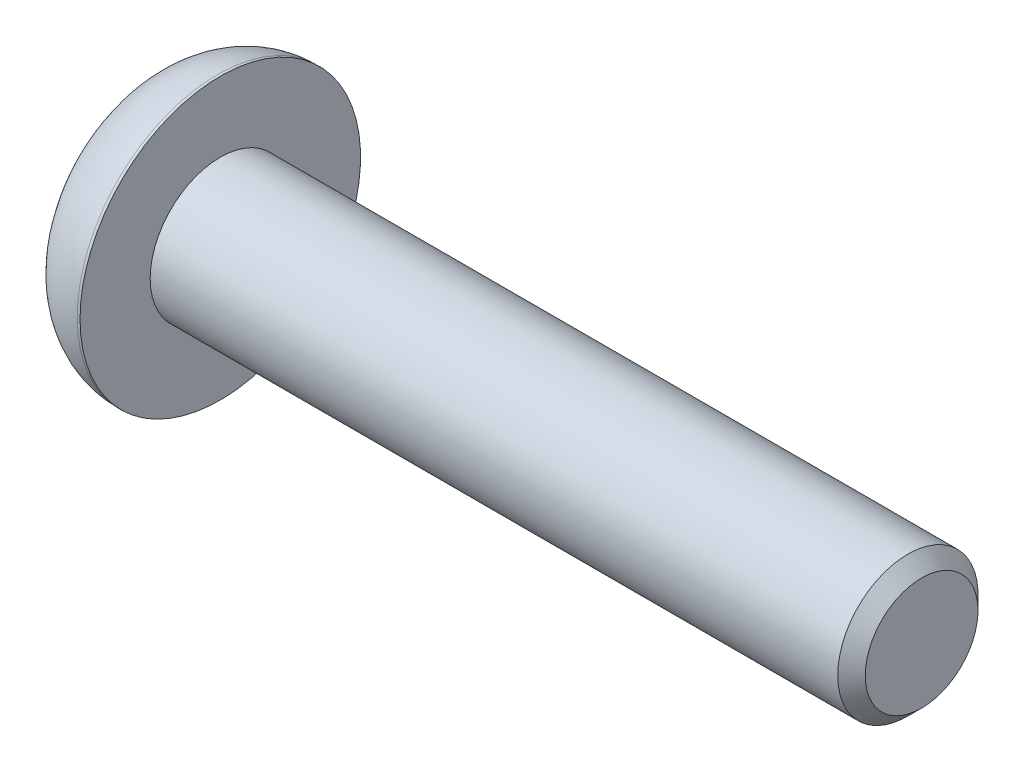
ISO-10303-21;
HEADER;
FILE_DESCRIPTION(('STEP AP214'),'2;1');
FILE_NAME('part.step','',(''),(''),'','','');
FILE_SCHEMA(('AUTOMOTIVE_DESIGN { 1 0 10303 214 1 1 1 1 }'));
ENDSEC;
DATA;
#1=APPLICATION_CONTEXT('core data for automotive mechanical design processes');
#2=APPLICATION_PROTOCOL_DEFINITION('international standard','automotive_design',2000,#1);
#3=PRODUCT_CONTEXT('',#1,'mechanical');
#4=PRODUCT('Part','Part','',(#3));
#5=PRODUCT_RELATED_PRODUCT_CATEGORY('part','',(#4));
#6=PRODUCT_DEFINITION_FORMATION('','',#4);
#7=PRODUCT_DEFINITION_CONTEXT('part definition',#1,'design');
#8=PRODUCT_DEFINITION('design','',#6,#7);
#9=PRODUCT_DEFINITION_SHAPE('','',#8);
#10=(LENGTH_UNIT() NAMED_UNIT(*) SI_UNIT(.MILLI.,.METRE.));
#11=(NAMED_UNIT(*) PLANE_ANGLE_UNIT() SI_UNIT($,.RADIAN.));
#12=(NAMED_UNIT(*) SI_UNIT($,.STERADIAN.) SOLID_ANGLE_UNIT());
#13=UNCERTAINTY_MEASURE_WITH_UNIT(LENGTH_MEASURE(1.E-05),#10,'distance_accuracy_value','');
#14=(GEOMETRIC_REPRESENTATION_CONTEXT(3) GLOBAL_UNCERTAINTY_ASSIGNED_CONTEXT((#13)) GLOBAL_UNIT_ASSIGNED_CONTEXT((#10,
#11,#12)) REPRESENTATION_CONTEXT('',''));
#15=CARTESIAN_POINT('',(0.,0.,0.));
#16=DIRECTION('',(0.,0.,1.));
#17=DIRECTION('',(1.,0.,0.));
#18=AXIS2_PLACEMENT_3D('',#15,#16,#17);
#19=CARTESIAN_POINT('',(1.82,0.,0.));
#20=DIRECTION('',(-1.,0.,0.));
#21=DIRECTION('',(0.,0.,1.));
#22=AXIS2_PLACEMENT_3D('',#19,#20,#21);
#23=PLANE('',#22);
#24=CARTESIAN_POINT('',(1.82,0.,0.));
#25=DIRECTION('',(-1.,0.,0.));
#26=DIRECTION('',(0.,0.,1.));
#27=AXIS2_PLACEMENT_3D('',#24,#25,#26);
#28=CIRCLE('',#27,1.49999999999999);
#29=CARTESIAN_POINT('',(1.82,0.,1.49999999999999));
#30=VERTEX_POINT('',#29);
#31=CARTESIAN_POINT('',(1.82,1.29903810567665,0.749999999999995));
#32=VERTEX_POINT('',#31);
#33=EDGE_CURVE('E120',#30,#32,#28,.T.);
#34=ORIENTED_EDGE('',*,*,#33,.F.);
#35=DIRECTION('',(0.,1.,0.));
#36=VECTOR('',#35,1.);
#37=CARTESIAN_POINT('',(1.82,-0.866025403784438,1.5));
#38=LINE('',#37,#36);
#39=CARTESIAN_POINT('',(1.82,0.866025403784439,1.5));
#40=VERTEX_POINT('',#39);
#41=EDGE_CURVE('E148',#30,#40,#38,.T.);
#42=ORIENTED_EDGE('',*,*,#41,.T.);
#43=DIRECTION('',(0.,0.5,-0.866025403784439));
#44=VECTOR('',#43,1.);
#45=CARTESIAN_POINT('',(1.82,0.866025403784439,1.5));
#46=LINE('',#45,#44);
#47=EDGE_CURVE('E128',#40,#32,#46,.T.);
#48=ORIENTED_EDGE('',*,*,#47,.T.);
#49=EDGE_LOOP('',(#34,#42,#48));
#50=FACE_BOUND('',#49,.T.);
#51=ADVANCED_FACE('F37',(#50),#23,.T.);
#52=CARTESIAN_POINT('',(1.82,1.29903810567665,-0.749999999999994));
#53=VERTEX_POINT('',#52);
#54=EDGE_CURVE('E125',#32,#53,#28,.T.);
#55=ORIENTED_EDGE('',*,*,#54,.F.);
#56=CARTESIAN_POINT('',(1.82,1.73205080756888,0.));
#57=VERTEX_POINT('',#56);
#58=EDGE_CURVE('E132',#32,#57,#46,.T.);
#59=ORIENTED_EDGE('',*,*,#58,.T.);
#60=DIRECTION('',(0.,-0.5,-0.866025403784439));
#61=VECTOR('',#60,1.);
#62=CARTESIAN_POINT('',(1.82,1.73205080756888,0.));
#63=LINE('',#62,#61);
#64=EDGE_CURVE('E133',#57,#53,#63,.T.);
#65=ORIENTED_EDGE('',*,*,#64,.T.);
#66=EDGE_LOOP('',(#55,#59,#65));
#67=FACE_BOUND('',#66,.T.);
#68=ADVANCED_FACE('F204',(#67),#23,.T.);
#69=CARTESIAN_POINT('',(1.82,0.,-1.49999999999999));
#70=VERTEX_POINT('',#69);
#71=EDGE_CURVE('E267',#53,#70,#28,.T.);
#72=ORIENTED_EDGE('',*,*,#71,.F.);
#73=CARTESIAN_POINT('',(1.82,0.866025403784439,-1.5));
#74=VERTEX_POINT('',#73);
#75=EDGE_CURVE('E131',#53,#74,#63,.T.);
#76=ORIENTED_EDGE('',*,*,#75,.T.);
#77=DIRECTION('',(0.,-1.,0.));
#78=VECTOR('',#77,1.);
#79=CARTESIAN_POINT('',(1.82,0.866025403784439,-1.5));
#80=LINE('',#79,#78);
#81=EDGE_CURVE('E137',#74,#70,#80,.T.);
#82=ORIENTED_EDGE('',*,*,#81,.T.);
#83=EDGE_LOOP('',(#72,#76,#82));
#84=FACE_BOUND('',#83,.T.);
#85=ADVANCED_FACE('F210',(#84),#23,.T.);
#86=CARTESIAN_POINT('',(1.82,-1.29903810567665,-0.749999999999995));
#87=VERTEX_POINT('',#86);
#88=EDGE_CURVE('E239',#70,#87,#28,.T.);
#89=ORIENTED_EDGE('',*,*,#88,.F.);
#90=CARTESIAN_POINT('',(1.82,-0.866025403784439,-1.5));
#91=VERTEX_POINT('',#90);
#92=EDGE_CURVE('E136',#70,#91,#80,.T.);
#93=ORIENTED_EDGE('',*,*,#92,.T.);
#94=DIRECTION('',(0.,-0.5,0.866025403784439));
#95=VECTOR('',#94,1.);
#96=CARTESIAN_POINT('',(1.82,-0.866025403784439,-1.5));
#97=LINE('',#96,#95);
#98=EDGE_CURVE('E141',#91,#87,#97,.T.);
#99=ORIENTED_EDGE('',*,*,#98,.T.);
#100=EDGE_LOOP('',(#89,#93,#99));
#101=FACE_BOUND('',#100,.T.);
#102=ADVANCED_FACE('F226',(#101),#23,.T.);
#103=CARTESIAN_POINT('',(1.82,-1.29903810567666,0.75));
#104=VERTEX_POINT('',#103);
#105=EDGE_CURVE('E52',#87,#104,#28,.T.);
#106=ORIENTED_EDGE('',*,*,#105,.F.);
#107=CARTESIAN_POINT('',(1.82,-1.73205080756888,0.));
#108=VERTEX_POINT('',#107);
#109=EDGE_CURVE('E140',#87,#108,#97,.T.);
#110=ORIENTED_EDGE('',*,*,#109,.T.);
#111=DIRECTION('',(0.,0.5,0.866025403784439));
#112=VECTOR('',#111,1.);
#113=CARTESIAN_POINT('',(1.82,-1.73205080756888,0.));
#114=LINE('',#113,#112);
#115=EDGE_CURVE('E145',#108,#104,#114,.T.);
#116=ORIENTED_EDGE('',*,*,#115,.T.);
#117=EDGE_LOOP('',(#106,#110,#116));
#118=FACE_BOUND('',#117,.T.);
#119=ADVANCED_FACE('F217',(#118),#23,.T.);
#120=CARTESIAN_POINT('',(2.8,5.,0.));
#121=DIRECTION('',(1.,0.,0.));
#122=DIRECTION('',(0.,0.,-1.));
#123=AXIS2_PLACEMENT_3D('',#120,#121,#122);
#124=PLANE('',#123);
#125=CARTESIAN_POINT('',(2.8,0.,0.));
#126=DIRECTION('',(-1.,0.,0.));
#127=DIRECTION('',(0.,0.,1.));
#128=AXIS2_PLACEMENT_3D('',#125,#126,#127);
#129=CIRCLE('',#128,5.);
#130=CARTESIAN_POINT('',(2.8,0.,5.));
#131=VERTEX_POINT('',#130);
#132=EDGE_CURVE('E181',#131,#131,#129,.T.);
#133=ORIENTED_EDGE('',*,*,#132,.F.);
#134=EDGE_LOOP('',(#133));
#135=FACE_BOUND('',#134,.T.);
#136=CARTESIAN_POINT('',(2.8,0.,0.));
#137=DIRECTION('',(1.,0.,0.));
#138=DIRECTION('',(0.,0.,-1.));
#139=AXIS2_PLACEMENT_3D('',#136,#137,#138);
#140=CIRCLE('',#139,2.5);
#141=CARTESIAN_POINT('',(2.8,0.,-2.5));
#142=VERTEX_POINT('',#141);
#143=EDGE_CURVE('E169',#142,#142,#140,.T.);
#144=ORIENTED_EDGE('',*,*,#143,.F.);
#145=EDGE_LOOP('',(#144));
#146=FACE_BOUND('',#145,.T.);
#147=ADVANCED_FACE('F225',(#135,#146),#124,.T.);
#148=CARTESIAN_POINT('',(2.8,0.,0.));
#149=DIRECTION('',(-1.,0.,0.));
#150=DIRECTION('',(0.,0.,1.));
#151=AXIS2_PLACEMENT_3D('',#148,#149,#150);
#152=CYLINDRICAL_SURFACE('',#151,5.);
#153=CARTESIAN_POINT('',(2.7,0.,0.));
#154=DIRECTION('',(-1.,0.,0.));
#155=DIRECTION('',(0.,0.,1.));
#156=AXIS2_PLACEMENT_3D('',#153,#154,#155);
#157=CIRCLE('',#156,5.);
#158=CARTESIAN_POINT('',(2.7,0.,5.));
#159=VERTEX_POINT('',#158);
#160=EDGE_CURVE('E11',#159,#159,#157,.F.);
#161=ORIENTED_EDGE('',*,*,#160,.T.);
#162=EDGE_LOOP('',(#161));
#163=FACE_BOUND('',#162,.T.);
#164=ORIENTED_EDGE('',*,*,#132,.T.);
#165=EDGE_LOOP('',(#164));
#166=FACE_BOUND('',#165,.T.);
#167=ADVANCED_FACE('F232',(#163,#166),#152,.T.);
#168=CARTESIAN_POINT('',(0.,0.,0.));
#169=DIRECTION('',(-1.,0.,0.));
#170=DIRECTION('',(0.,0.,1.));
#171=AXIS2_PLACEMENT_3D('',#168,#169,#170);
#172=PLANE('',#171);
#173=CARTESIAN_POINT('',(0.,0.,0.));
#174=DIRECTION('',(-1.,0.,0.));
#175=DIRECTION('',(0.,0.,1.));
#176=AXIS2_PLACEMENT_3D('',#173,#174,#175);
#177=CIRCLE('',#176,2.3);
#178=CARTESIAN_POINT('',(0.,0.,2.3));
#179=VERTEX_POINT('',#178);
#180=EDGE_CURVE('E45',#179,#179,#177,.T.);
#181=ORIENTED_EDGE('',*,*,#180,.T.);
#182=EDGE_LOOP('',(#181));
#183=FACE_BOUND('',#182,.T.);
#184=DIRECTION('',(0.,0.5,-0.866025403784439));
#185=VECTOR('',#184,1.);
#186=CARTESIAN_POINT('',(0.,0.866025403784439,1.5));
#187=LINE('',#186,#185);
#188=CARTESIAN_POINT('',(0.,0.866025403784439,1.5));
#189=VERTEX_POINT('',#188);
#190=CARTESIAN_POINT('',(0.,1.73205080756888,0.));
#191=VERTEX_POINT('',#190);
#192=EDGE_CURVE('E60',#189,#191,#187,.T.);
#193=ORIENTED_EDGE('',*,*,#192,.F.);
#194=DIRECTION('',(0.,1.,0.));
#195=VECTOR('',#194,1.);
#196=CARTESIAN_POINT('',(0.,-0.866025403784438,1.5));
#197=LINE('',#196,#195);
#198=CARTESIAN_POINT('',(0.,-0.866025403784438,1.5));
#199=VERTEX_POINT('',#198);
#200=EDGE_CURVE('E164',#199,#189,#197,.T.);
#201=ORIENTED_EDGE('',*,*,#200,.F.);
#202=DIRECTION('',(0.,0.5,0.866025403784439));
#203=VECTOR('',#202,1.);
#204=CARTESIAN_POINT('',(0.,-1.73205080756888,0.));
#205=LINE('',#204,#203);
#206=CARTESIAN_POINT('',(0.,-1.73205080756888,0.));
#207=VERTEX_POINT('',#206);
#208=EDGE_CURVE('E161',#207,#199,#205,.T.);
#209=ORIENTED_EDGE('',*,*,#208,.F.);
#210=DIRECTION('',(0.,-0.5,0.866025403784439));
#211=VECTOR('',#210,1.);
#212=CARTESIAN_POINT('',(0.,-0.866025403784439,-1.5));
#213=LINE('',#212,#211);
#214=CARTESIAN_POINT('',(0.,-0.866025403784439,-1.5));
#215=VERTEX_POINT('',#214);
#216=EDGE_CURVE('E158',#215,#207,#213,.T.);
#217=ORIENTED_EDGE('',*,*,#216,.F.);
#218=DIRECTION('',(0.,-1.,0.));
#219=VECTOR('',#218,1.);
#220=CARTESIAN_POINT('',(0.,0.866025403784439,-1.5));
#221=LINE('',#220,#219);
#222=CARTESIAN_POINT('',(0.,0.866025403784439,-1.5));
#223=VERTEX_POINT('',#222);
#224=EDGE_CURVE('E155',#223,#215,#221,.T.);
#225=ORIENTED_EDGE('',*,*,#224,.F.);
#226=DIRECTION('',(0.,-0.5,-0.866025403784439));
#227=VECTOR('',#226,1.);
#228=CARTESIAN_POINT('',(0.,1.73205080756888,0.));
#229=LINE('',#228,#227);
#230=EDGE_CURVE('E122',#191,#223,#229,.T.);
#231=ORIENTED_EDGE('',*,*,#230,.F.);
#232=EDGE_LOOP('',(#193,#201,#209,#217,#225,#231));
#233=FACE_BOUND('',#232,.T.);
#234=ADVANCED_FACE('F192',(#183,#233),#172,.T.);
#235=CARTESIAN_POINT('',(27.8,0.,0.));
#236=DIRECTION('',(-1.,0.,0.));
#237=DIRECTION('',(0.,0.,1.));
#238=AXIS2_PLACEMENT_3D('',#235,#236,#237);
#239=CYLINDRICAL_SURFACE('',#238,2.5);
#240=CARTESIAN_POINT('',(27.3094999999577,0.,0.));
#241=DIRECTION('',(1.,0.,0.));
#242=DIRECTION('',(0.,0.,-1.));
#243=AXIS2_PLACEMENT_3D('',#240,#241,#242);
#244=CIRCLE('',#243,2.5);
#245=CARTESIAN_POINT('',(27.3094999999577,0.,2.5));
#246=VERTEX_POINT('',#245);
#247=EDGE_CURVE('E187',#246,#246,#244,.F.);
#248=ORIENTED_EDGE('',*,*,#247,.T.);
#249=EDGE_LOOP('',(#248));
#250=FACE_BOUND('',#249,.T.);
#251=ORIENTED_EDGE('',*,*,#143,.T.);
#252=EDGE_LOOP('',(#251));
#253=FACE_BOUND('',#252,.T.);
#254=ADVANCED_FACE('F358',(#250,#253),#239,.T.);
#255=CARTESIAN_POINT('',(27.8,0.,0.));
#256=DIRECTION('',(1.,0.,0.));
#257=DIRECTION('',(0.,0.,-1.));
#258=AXIS2_PLACEMENT_3D('',#255,#256,#257);
#259=PLANE('',#258);
#260=CARTESIAN_POINT('',(27.8,0.,0.));
#261=DIRECTION('',(1.,0.,0.));
#262=DIRECTION('',(0.,0.,-1.));
#263=AXIS2_PLACEMENT_3D('',#260,#261,#262);
#264=CIRCLE('',#263,2.00949999995768);
#265=CARTESIAN_POINT('',(27.8,0.,2.00949999995769));
#266=VERTEX_POINT('',#265);
#267=EDGE_CURVE('E184',#266,#266,#264,.T.);
#268=ORIENTED_EDGE('',*,*,#267,.T.);
#269=EDGE_LOOP('',(#268));
#270=FACE_BOUND('',#269,.T.);
#271=ADVANCED_FACE('F295',(#270),#259,.T.);
#272=CARTESIAN_POINT('',(1.82,0.866025403784439,1.5));
#273=DIRECTION('',(0.,0.866025403784439,0.5));
#274=DIRECTION('',(0.,-0.5,0.866025403784439));
#275=AXIS2_PLACEMENT_3D('',#272,#273,#274);
#276=PLANE('',#275);
#277=ORIENTED_EDGE('',*,*,#192,.T.);
#278=DIRECTION('',(-1.,0.,0.));
#279=VECTOR('',#278,1.);
#280=CARTESIAN_POINT('',(1.82,1.73205080756888,0.));
#281=LINE('',#280,#279);
#282=EDGE_CURVE('E151',#57,#191,#281,.T.);
#283=ORIENTED_EDGE('',*,*,#282,.F.);
#284=ORIENTED_EDGE('',*,*,#58,.F.);
#285=ORIENTED_EDGE('',*,*,#47,.F.);
#286=DIRECTION('',(-1.,0.,0.));
#287=VECTOR('',#286,1.);
#288=CARTESIAN_POINT('',(1.82,0.866025403784439,1.5));
#289=LINE('',#288,#287);
#290=EDGE_CURVE('E167',#40,#189,#289,.T.);
#291=ORIENTED_EDGE('',*,*,#290,.T.);
#292=EDGE_LOOP('',(#277,#283,#284,#285,#291));
#293=FACE_BOUND('',#292,.T.);
#294=ADVANCED_FACE('F264',(#293),#276,.F.);
#295=CARTESIAN_POINT('',(1.82,-0.866025403784438,1.5));
#296=DIRECTION('',(0.,0.,1.));
#297=DIRECTION('',(0.,-1.,0.));
#298=AXIS2_PLACEMENT_3D('',#295,#296,#297);
#299=PLANE('',#298);
#300=ORIENTED_EDGE('',*,*,#200,.T.);
#301=ORIENTED_EDGE('',*,*,#290,.F.);
#302=ORIENTED_EDGE('',*,*,#41,.F.);
#303=CARTESIAN_POINT('',(1.82,-0.866025403784438,1.5));
#304=VERTEX_POINT('',#303);
#305=EDGE_CURVE('E149',#304,#30,#38,.T.);
#306=ORIENTED_EDGE('',*,*,#305,.F.);
#307=DIRECTION('',(-1.,0.,0.));
#308=VECTOR('',#307,1.);
#309=CARTESIAN_POINT('',(1.82,-0.866025403784438,1.5));
#310=LINE('',#309,#308);
#311=EDGE_CURVE('E170',#304,#199,#310,.T.);
#312=ORIENTED_EDGE('',*,*,#311,.T.);
#313=EDGE_LOOP('',(#300,#301,#302,#306,#312));
#314=FACE_BOUND('',#313,.T.);
#315=ADVANCED_FACE('F262',(#314),#299,.F.);
#316=CARTESIAN_POINT('',(1.82,-1.73205080756888,0.));
#317=DIRECTION('',(0.,-0.866025403784439,0.5));
#318=DIRECTION('',(0.,-0.5,-0.866025403784439));
#319=AXIS2_PLACEMENT_3D('',#316,#317,#318);
#320=PLANE('',#319);
#321=ORIENTED_EDGE('',*,*,#208,.T.);
#322=ORIENTED_EDGE('',*,*,#311,.F.);
#323=EDGE_CURVE('E144',#104,#304,#114,.T.);
#324=ORIENTED_EDGE('',*,*,#323,.F.);
#325=ORIENTED_EDGE('',*,*,#115,.F.);
#326=DIRECTION('',(-1.,0.,0.));
#327=VECTOR('',#326,1.);
#328=CARTESIAN_POINT('',(1.82,-1.73205080756888,0.));
#329=LINE('',#328,#327);
#330=EDGE_CURVE('E172',#108,#207,#329,.T.);
#331=ORIENTED_EDGE('',*,*,#330,.T.);
#332=EDGE_LOOP('',(#321,#322,#324,#325,#331));
#333=FACE_BOUND('',#332,.T.);
#334=ADVANCED_FACE('F254',(#333),#320,.F.);
#335=CARTESIAN_POINT('',(1.82,-0.866025403784439,-1.5));
#336=DIRECTION('',(0.,-0.866025403784439,-0.5));
#337=DIRECTION('',(0.,0.5,-0.866025403784439));
#338=AXIS2_PLACEMENT_3D('',#335,#336,#337);
#339=PLANE('',#338);
#340=ORIENTED_EDGE('',*,*,#216,.T.);
#341=ORIENTED_EDGE('',*,*,#330,.F.);
#342=ORIENTED_EDGE('',*,*,#109,.F.);
#343=ORIENTED_EDGE('',*,*,#98,.F.);
#344=DIRECTION('',(-1.,0.,0.));
#345=VECTOR('',#344,1.);
#346=CARTESIAN_POINT('',(1.82,-0.866025403784439,-1.5));
#347=LINE('',#346,#345);
#348=EDGE_CURVE('E174',#91,#215,#347,.T.);
#349=ORIENTED_EDGE('',*,*,#348,.T.);
#350=EDGE_LOOP('',(#340,#341,#342,#343,#349));
#351=FACE_BOUND('',#350,.T.);
#352=ADVANCED_FACE('F242',(#351),#339,.F.);
#353=CARTESIAN_POINT('',(1.82,0.866025403784439,-1.5));
#354=DIRECTION('',(0.,0.,-1.));
#355=DIRECTION('',(-1.,0.,0.));
#356=AXIS2_PLACEMENT_3D('',#353,#354,#355);
#357=PLANE('',#356);
#358=ORIENTED_EDGE('',*,*,#224,.T.);
#359=ORIENTED_EDGE('',*,*,#348,.F.);
#360=ORIENTED_EDGE('',*,*,#92,.F.);
#361=ORIENTED_EDGE('',*,*,#81,.F.);
#362=DIRECTION('',(-1.,0.,0.));
#363=VECTOR('',#362,1.);
#364=CARTESIAN_POINT('',(1.82,0.866025403784439,-1.5));
#365=LINE('',#364,#363);
#366=EDGE_CURVE('E176',#74,#223,#365,.T.);
#367=ORIENTED_EDGE('',*,*,#366,.T.);
#368=EDGE_LOOP('',(#358,#359,#360,#361,#367));
#369=FACE_BOUND('',#368,.T.);
#370=ADVANCED_FACE('F221',(#369),#357,.F.);
#371=CARTESIAN_POINT('',(1.82,1.73205080756888,0.));
#372=DIRECTION('',(0.,0.866025403784439,-0.5));
#373=DIRECTION('',(0.,0.5,0.866025403784439));
#374=AXIS2_PLACEMENT_3D('',#371,#372,#373);
#375=PLANE('',#374);
#376=ORIENTED_EDGE('',*,*,#230,.T.);
#377=ORIENTED_EDGE('',*,*,#366,.F.);
#378=ORIENTED_EDGE('',*,*,#75,.F.);
#379=ORIENTED_EDGE('',*,*,#64,.F.);
#380=ORIENTED_EDGE('',*,*,#282,.T.);
#381=EDGE_LOOP('',(#376,#377,#378,#379,#380));
#382=FACE_BOUND('',#381,.T.);
#383=ADVANCED_FACE('F215',(#382),#375,.F.);
#384=EDGE_CURVE('E126',#104,#30,#28,.T.);
#385=ORIENTED_EDGE('',*,*,#384,.F.);
#386=ORIENTED_EDGE('',*,*,#323,.T.);
#387=ORIENTED_EDGE('',*,*,#305,.T.);
#388=EDGE_LOOP('',(#385,#386,#387));
#389=FACE_BOUND('',#388,.T.);
#390=ADVANCED_FACE('F114',(#389),#23,.T.);
#391=CARTESIAN_POINT('',(1.93397459621557,0.,0.));
#392=DIRECTION('',(-1.,0.,0.));
#393=DIRECTION('',(0.,0.,1.));
#394=AXIS2_PLACEMENT_3D('',#391,#392,#393);
#395=CONICAL_SURFACE('',#394,1.49999999999999,1.04719755119044);
#396=CARTESIAN_POINT('',(2.80000000001231,0.,0.));
#397=VERTEX_POINT('',#396);
#398=VERTEX_LOOP('',#397);
#399=FACE_BOUND('',#398,.T.);
#400=CARTESIAN_POINT('',(1.93397459621557,0.,0.));
#401=DIRECTION('',(-1.,0.,0.));
#402=DIRECTION('',(0.,0.,1.));
#403=AXIS2_PLACEMENT_3D('',#400,#401,#402);
#404=CIRCLE('',#403,1.49999999999999);
#405=CARTESIAN_POINT('',(1.93397459621557,0.,1.49999999999999));
#406=VERTEX_POINT('',#405);
#407=EDGE_CURVE('E118',#406,#406,#404,.T.);
#408=ORIENTED_EDGE('',*,*,#407,.T.);
#409=EDGE_LOOP('',(#408));
#410=FACE_BOUND('',#409,.T.);
#411=ADVANCED_FACE('F110',(#399,#410),#395,.F.);
#412=CARTESIAN_POINT('',(1.82,0.,0.));
#413=DIRECTION('',(-1.,0.,0.));
#414=DIRECTION('',(0.,0.,1.));
#415=AXIS2_PLACEMENT_3D('',#412,#413,#414);
#416=CYLINDRICAL_SURFACE('',#415,1.49999999999999);
#417=ORIENTED_EDGE('',*,*,#407,.F.);
#418=EDGE_LOOP('',(#417));
#419=FACE_BOUND('',#418,.T.);
#420=ORIENTED_EDGE('',*,*,#33,.T.);
#421=ORIENTED_EDGE('',*,*,#54,.T.);
#422=ORIENTED_EDGE('',*,*,#71,.T.);
#423=ORIENTED_EDGE('',*,*,#88,.T.);
#424=ORIENTED_EDGE('',*,*,#105,.T.);
#425=ORIENTED_EDGE('',*,*,#384,.T.);
#426=EDGE_LOOP('',(#420,#421,#422,#423,#424,#425));
#427=FACE_BOUND('',#426,.T.);
#428=ADVANCED_FACE('F113',(#419,#427),#416,.F.);
#429=CARTESIAN_POINT('',(27.8,0.,0.));
#430=DIRECTION('',(-1.,0.,0.));
#431=DIRECTION('',(0.,0.,1.));
#432=AXIS2_PLACEMENT_3D('',#429,#430,#431);
#433=CONICAL_SURFACE('',#432,2.00949999995768,0.785398163397446);
#434=CARTESIAN_POINT('',(27.3094999999577,0.,2.5));
#435=CARTESIAN_POINT('',(27.3146093749581,0.,2.49489062499956));
#436=CARTESIAN_POINT('',(27.3197187499586,0.,2.48978124999912));
#437=CARTESIAN_POINT('',(27.3299374999594,0.,2.47956249999824));
#438=CARTESIAN_POINT('',(27.3350468749599,0.,2.4744531249978));
#439=CARTESIAN_POINT('',(27.3452656249608,0.,2.46423437499692));
#440=CARTESIAN_POINT('',(27.3503749999612,0.,2.45912499999648));
#441=CARTESIAN_POINT('',(27.3605937499621,0.,2.44890624999559));
#442=CARTESIAN_POINT('',(27.3657031249625,0.,2.44379687499515));
#443=CARTESIAN_POINT('',(27.3759218749634,0.,2.43357812499427));
#444=CARTESIAN_POINT('',(27.3810312499639,0.,2.42846874999383));
#445=CARTESIAN_POINT('',(27.3912499999647,0.,2.41824999999295));
#446=CARTESIAN_POINT('',(27.3963593749652,0.,2.41314062499251));
#447=CARTESIAN_POINT('',(27.4065781249661,0.,2.40292187499163));
#448=CARTESIAN_POINT('',(27.4116874999665,0.,2.39781249999119));
#449=CARTESIAN_POINT('',(27.4219062499674,0.,2.3875937499903));
#450=CARTESIAN_POINT('',(27.4270156249678,0.,2.38248437498986));
#451=CARTESIAN_POINT('',(27.4372343749687,0.,2.37226562498898));
#452=CARTESIAN_POINT('',(27.4423437499691,0.,2.36715624998854));
#453=CARTESIAN_POINT('',(27.45256249997,0.,2.35693749998766));
#454=CARTESIAN_POINT('',(27.4576718749705,0.,2.35182812498722));
#455=CARTESIAN_POINT('',(27.4678906249713,0.,2.34160937498634));
#456=CARTESIAN_POINT('',(27.4729999999718,0.,2.3364999999859));
#457=CARTESIAN_POINT('',(27.4832187499727,0.,2.32628124998501));
#458=CARTESIAN_POINT('',(27.4883281249731,0.,2.32117187498457));
#459=CARTESIAN_POINT('',(27.498546874974,0.,2.31095312498369));
#460=CARTESIAN_POINT('',(27.5036562499744,0.,2.30584374998325));
#461=CARTESIAN_POINT('',(27.5138749999753,0.,2.29562499998237));
#462=CARTESIAN_POINT('',(27.5189843749758,0.,2.29051562498193));
#463=CARTESIAN_POINT('',(27.5292031249766,0.,2.28029687498105));
#464=CARTESIAN_POINT('',(27.5343124999771,0.,2.27518749998061));
#465=CARTESIAN_POINT('',(27.544531249978,0.,2.26496874997973));
#466=CARTESIAN_POINT('',(27.5496406249784,0.,2.25985937497928));
#467=CARTESIAN_POINT('',(27.5598593749793,0.,2.2496406249784));
#468=CARTESIAN_POINT('',(27.5649687499797,0.,2.24453124997796));
#469=CARTESIAN_POINT('',(27.5751874999806,0.,2.23431249997708));
#470=CARTESIAN_POINT('',(27.5802968749811,0.,2.22920312497664));
#471=CARTESIAN_POINT('',(27.5905156249819,0.,2.21898437497576));
#472=CARTESIAN_POINT('',(27.5956249999824,0.,2.21387499997532));
#473=CARTESIAN_POINT('',(27.6058437499833,0.,2.20365624997444));
#474=CARTESIAN_POINT('',(27.6109531249837,0.,2.19854687497399));
#475=CARTESIAN_POINT('',(27.6211718749846,0.,2.18832812497311));
#476=CARTESIAN_POINT('',(27.626281249985,0.,2.18321874997267));
#477=CARTESIAN_POINT('',(27.6364999999859,0.,2.17299999997179));
#478=CARTESIAN_POINT('',(27.6416093749863,0.,2.16789062497135));
#479=CARTESIAN_POINT('',(27.6518281249872,0.,2.15767187497047));
#480=CARTESIAN_POINT('',(27.6569374999877,0.,2.15256249997003));
#481=CARTESIAN_POINT('',(27.6671562499885,0.,2.14234374996915));
#482=CARTESIAN_POINT('',(27.672265624989,0.,2.13723437496871));
#483=CARTESIAN_POINT('',(27.6824843749899,0.,2.12701562496782));
#484=CARTESIAN_POINT('',(27.6875937499903,0.,2.12190624996738));
#485=CARTESIAN_POINT('',(27.6978124999912,0.,2.1116874999665));
#486=CARTESIAN_POINT('',(27.7029218749916,0.,2.10657812496606));
#487=CARTESIAN_POINT('',(27.7131406249925,0.,2.09635937496518));
#488=CARTESIAN_POINT('',(27.7182499999929,0.,2.09124999996474));
#489=CARTESIAN_POINT('',(27.7284687499938,0.,2.08103124996386));
#490=CARTESIAN_POINT('',(27.7335781249943,0.,2.07592187496342));
#491=CARTESIAN_POINT('',(27.7437968749952,0.,2.06570312496253));
#492=CARTESIAN_POINT('',(27.7489062499956,0.,2.06059374996209));
#493=CARTESIAN_POINT('',(27.7591249999965,0.,2.05037499996121));
#494=CARTESIAN_POINT('',(27.7642343749969,0.,2.04526562496077));
#495=CARTESIAN_POINT('',(27.7744531249978,0.,2.03504687495989));
#496=CARTESIAN_POINT('',(27.7795624999982,0.,2.02993749995945));
#497=CARTESIAN_POINT('',(27.7897812499991,0.,2.01971874995857));
#498=CARTESIAN_POINT('',(27.7948906249996,0.,2.01460937495813));
#499=CARTESIAN_POINT('',(27.8,0.,2.00949999995769));
#500=B_SPLINE_CURVE_WITH_KNOTS('',3,(#434,#435,#436,#437,#438,#439,#440,#441,#442,#443,#444,
#445,#446,#447,#448,#449,#450,#451,#452,#453,#454,#455,#456,#457,#458,#459,#460,#461,#462,#463,
#464,#465,#466,#467,#468,#469,#470,#471,#472,#473,#474,#475,#476,#477,#478,#479,#480,#481,#482,
#483,#484,#485,#486,#487,#488,#489,#490,#491,#492,#493,#494,#495,#496,#497,#498,#499),
.UNSPECIFIED.,.F.,.F.,(4,2,2,2,2,2,2,2,2,2,2,2,2,2,2,2,2,2,2,2,2,2,2,2,2,2,2,2,2,2,2,2,4),(0.,
0.0216772422626212,0.0433544845252425,0.0650317267878612,0.0867089690504825,0.108386211313104,
0.130063453575722,0.151740695838343,0.173417938100962,0.195095180363583,0.216772422626205,
0.238449664888823,0.260126907151445,0.281804149414066,0.303481391676685,0.325158633939306,
0.346835876201924,0.368513118464546,0.390190360727167,0.411867602989786,0.433544845252407,
0.455222087515028,0.476899329777647,0.498576572040268,0.520253814302887,0.541931056565508,
0.563608298828129,0.585285541090748,0.606962783353369,0.62864002561599,0.650317267878609,
0.67199451014123,0.693671752403851),.UNSPECIFIED.);
#501=EDGE_CURVE('BSEAM196',#246,#266,#500,.T.);
#502=ORIENTED_EDGE('',*,*,#247,.F.);
#503=ORIENTED_EDGE('',*,*,#267,.F.);
#504=ORIENTED_EDGE('',*,*,#501,.T.);
#505=ORIENTED_EDGE('',*,*,#501,.F.);
#506=EDGE_LOOP('',(#502,#504,#503,#505));
#507=FACE_BOUND('',#506,.T.);
#508=ADVANCED_FACE('F196',(#507),#433,.T.);
#509=CARTESIAN_POINT('',(2.7,0.,0.));
#510=DIRECTION('',(-1.,0.,0.));
#511=DIRECTION('',(0.,0.,1.));
#512=AXIS2_PLACEMENT_3D('',#509,#510,#511);
#513=DEGENERATE_TOROIDAL_SURFACE('',#512,2.3,2.7,.T.);
#514=ORIENTED_EDGE('',*,*,#160,.F.);
#515=EDGE_LOOP('',(#514));
#516=FACE_BOUND('',#515,.T.);
#517=ORIENTED_EDGE('',*,*,#180,.F.);
#518=EDGE_LOOP('',(#517));
#519=FACE_BOUND('',#518,.T.);
#520=ADVANCED_FACE('F39',(#516,#519),#513,.T.);
#521=CLOSED_SHELL('',(#51,#68,#85,#102,#119,#147,#167,#234,#254,#271,#294,#315,#334,#352,#370,
#383,#390,#411,#428,#508,#520));
#522=MANIFOLD_SOLID_BREP('B2',#521);
#523=ADVANCED_BREP_SHAPE_REPRESENTATION('',(#18,#522),#14);
#524=SHAPE_DEFINITION_REPRESENTATION(#9,#523);
ENDSEC;
END-ISO-10303-21;
